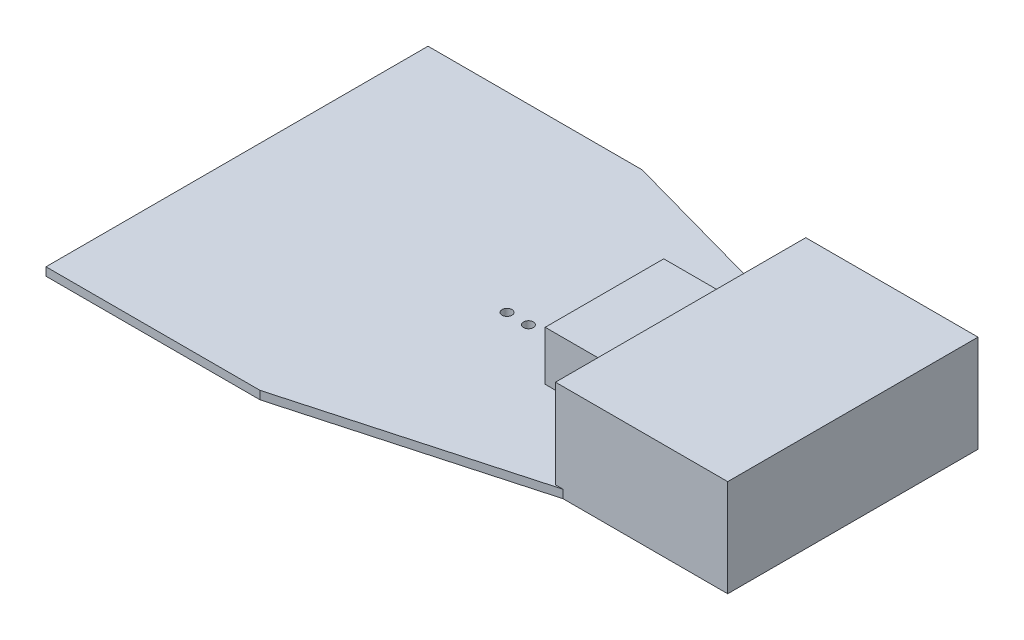
ISO-10303-21;
HEADER;
FILE_DESCRIPTION(('STEP AP214'),'2;1');
FILE_NAME('part.step','',(''),(''),'','','');
FILE_SCHEMA(('AUTOMOTIVE_DESIGN { 1 0 10303 214 1 1 1 1 }'));
ENDSEC;
DATA;
#1=APPLICATION_CONTEXT('core data for automotive mechanical design processes');
#2=APPLICATION_PROTOCOL_DEFINITION('international standard','automotive_design',2000,#1);
#3=PRODUCT_CONTEXT('',#1,'mechanical');
#4=PRODUCT('Part','Part','',(#3));
#5=PRODUCT_RELATED_PRODUCT_CATEGORY('part','',(#4));
#6=PRODUCT_DEFINITION_FORMATION('','',#4);
#7=PRODUCT_DEFINITION_CONTEXT('part definition',#1,'design');
#8=PRODUCT_DEFINITION('design','',#6,#7);
#9=PRODUCT_DEFINITION_SHAPE('','',#8);
#10=(LENGTH_UNIT() NAMED_UNIT(*) SI_UNIT(.MILLI.,.METRE.));
#11=(NAMED_UNIT(*) PLANE_ANGLE_UNIT() SI_UNIT($,.RADIAN.));
#12=(NAMED_UNIT(*) SI_UNIT($,.STERADIAN.) SOLID_ANGLE_UNIT());
#13=UNCERTAINTY_MEASURE_WITH_UNIT(LENGTH_MEASURE(1.E-05),#10,'distance_accuracy_value','');
#14=(GEOMETRIC_REPRESENTATION_CONTEXT(3) GLOBAL_UNCERTAINTY_ASSIGNED_CONTEXT((#13)) GLOBAL_UNIT_ASSIGNED_CONTEXT((#10,
#11,#12)) REPRESENTATION_CONTEXT('',''));
#15=CARTESIAN_POINT('',(0.,0.,0.));
#16=DIRECTION('',(0.,0.,1.));
#17=DIRECTION('',(1.,0.,0.));
#18=AXIS2_PLACEMENT_3D('',#15,#16,#17);
#19=CARTESIAN_POINT('',(0.,2.5,0.));
#20=DIRECTION('',(0.,1.,0.));
#21=DIRECTION('',(0.,0.,1.));
#22=AXIS2_PLACEMENT_3D('',#19,#20,#21);
#23=PLANE('',#22);
#24=CARTESIAN_POINT('',(-39.6368268534392,2.5,14.1756485798957));
#25=DIRECTION('',(0.,1.,0.));
#26=DIRECTION('',(0.,0.,1.));
#27=AXIS2_PLACEMENT_3D('',#24,#25,#26);
#28=CIRCLE('',#27,1.5);
#29=CARTESIAN_POINT('',(-39.6368268534392,2.5,15.6756485798957));
#30=VERTEX_POINT('',#29);
#31=EDGE_CURVE('E217',#30,#30,#28,.T.);
#32=ORIENTED_EDGE('',*,*,#31,.F.);
#33=EDGE_LOOP('',(#32));
#34=FACE_BOUND('',#33,.T.);
#35=CARTESIAN_POINT('',(-33.1368268534392,2.5,14.1756485798957));
#36=DIRECTION('',(0.,1.,0.));
#37=DIRECTION('',(0.,0.,1.));
#38=AXIS2_PLACEMENT_3D('',#35,#36,#37);
#39=CIRCLE('',#38,1.5);
#40=CARTESIAN_POINT('',(-33.1368268534392,2.5,15.6756485798957));
#41=VERTEX_POINT('',#40);
#42=EDGE_CURVE('E214',#41,#41,#39,.T.);
#43=ORIENTED_EDGE('',*,*,#42,.F.);
#44=EDGE_LOOP('',(#43));
#45=FACE_BOUND('',#44,.T.);
#46=CARTESIAN_POINT('',(-0.936826853439245,2.5,-11.3521291978821));
#47=DIRECTION('',(0.,1.,0.));
#48=DIRECTION('',(0.,0.,1.));
#49=AXIS2_PLACEMENT_3D('',#46,#47,#48);
#50=CIRCLE('',#49,1.5);
#51=CARTESIAN_POINT('',(-0.936826853439245,2.5,-9.85212919788209));
#52=VERTEX_POINT('',#51);
#53=EDGE_CURVE('E205',#52,#52,#50,.T.);
#54=ORIENTED_EDGE('',*,*,#53,.F.);
#55=EDGE_LOOP('',(#54));
#56=FACE_BOUND('',#55,.T.);
#57=CARTESIAN_POINT('',(-0.93682685343924,2.5,29.9478708021179));
#58=DIRECTION('',(0.,1.,0.));
#59=DIRECTION('',(0.,0.,1.));
#60=AXIS2_PLACEMENT_3D('',#57,#58,#59);
#61=CIRCLE('',#60,1.5);
#62=CARTESIAN_POINT('',(-0.93682685343924,2.5,31.4478708021179));
#63=VERTEX_POINT('',#62);
#64=EDGE_CURVE('E202',#63,#63,#61,.T.);
#65=ORIENTED_EDGE('',*,*,#64,.F.);
#66=EDGE_LOOP('',(#65));
#67=FACE_BOUND('',#66,.T.);
#68=DIRECTION('',(0.,0.,1.));
#69=VECTOR('',#68,1.);
#70=CARTESIAN_POINT('',(13.0631731465608,2.5,-23.8243514201043));
#71=LINE('',#70,#69);
#72=CARTESIAN_POINT('',(13.0631731465608,2.5,-23.8243514201043));
#73=VERTEX_POINT('',#72);
#74=CARTESIAN_POINT('',(13.0631731465608,2.5,-8.7021291978821));
#75=VERTEX_POINT('',#74);
#76=EDGE_CURVE('E50',#73,#75,#71,.T.);
#77=ORIENTED_EDGE('',*,*,#76,.F.);
#78=DIRECTION('',(-1.,0.,0.));
#79=VECTOR('',#78,1.);
#80=CARTESIAN_POINT('',(65.3631731465608,2.5,-23.8243514201043));
#81=LINE('',#80,#79);
#82=CARTESIAN_POINT('',(15.3631731465607,2.5,-23.8243514201043));
#83=VERTEX_POINT('',#82);
#84=EDGE_CURVE('E166',#83,#73,#81,.T.);
#85=ORIENTED_EDGE('',*,*,#84,.F.);
#86=DIRECTION('',(-0.963517909629941,0.,-0.267643863786095));
#87=VECTOR('',#86,1.);
#88=CARTESIAN_POINT('',(7.24432938817596,2.5,-26.0795857974334));
#89=LINE('',#88,#87);
#90=CARTESIAN_POINT('',(-56.6368268534393,2.5,-43.8243514201043));
#91=VERTEX_POINT('',#90);
#92=EDGE_CURVE('E228',#83,#91,#89,.T.);
#93=ORIENTED_EDGE('',*,*,#92,.T.);
#94=DIRECTION('',(-1.,0.,0.));
#95=VECTOR('',#94,1.);
#96=CARTESIAN_POINT('',(0.,2.5,-43.8243514201043));
#97=LINE('',#96,#95);
#98=CARTESIAN_POINT('',(-121.636826853439,2.5,-43.8243514201043));
#99=VERTEX_POINT('',#98);
#100=EDGE_CURVE('E231',#91,#99,#97,.T.);
#101=ORIENTED_EDGE('',*,*,#100,.T.);
#102=DIRECTION('',(0.,0.,1.));
#103=VECTOR('',#102,1.);
#104=CARTESIAN_POINT('',(-121.636826853439,2.5,0.));
#105=LINE('',#104,#103);
#106=CARTESIAN_POINT('',(-121.636826853439,2.5,72.1756485798957));
#107=VERTEX_POINT('',#106);
#108=EDGE_CURVE('E233',#99,#107,#105,.T.);
#109=ORIENTED_EDGE('',*,*,#108,.T.);
#110=DIRECTION('',(1.,0.,0.));
#111=VECTOR('',#110,1.);
#112=CARTESIAN_POINT('',(0.,2.5,72.1756485798957));
#113=LINE('',#112,#111);
#114=CARTESIAN_POINT('',(-56.6368268534393,2.5,72.1756485798957));
#115=VERTEX_POINT('',#114);
#116=EDGE_CURVE('E235',#107,#115,#113,.T.);
#117=ORIENTED_EDGE('',*,*,#116,.T.);
#118=DIRECTION('',(0.963517909629941,0.,-0.267643863786095));
#119=VECTOR('',#118,1.);
#120=CARTESIAN_POINT('',(14.5555521514459,2.5,52.3999877452054));
#121=LINE('',#120,#119);
#122=CARTESIAN_POINT('',(15.3631731465607,2.5,52.1756485798957));
#123=VERTEX_POINT('',#122);
#124=EDGE_CURVE('E226',#115,#123,#121,.T.);
#125=ORIENTED_EDGE('',*,*,#124,.T.);
#126=DIRECTION('',(1.,0.,0.));
#127=VECTOR('',#126,1.);
#128=CARTESIAN_POINT('',(65.3631731465608,2.5,52.1756485798957));
#129=LINE('',#128,#127);
#130=CARTESIAN_POINT('',(13.0631731465608,2.5,52.1756485798957));
#131=VERTEX_POINT('',#130);
#132=EDGE_CURVE('E57',#131,#123,#129,.T.);
#133=ORIENTED_EDGE('',*,*,#132,.F.);
#134=CARTESIAN_POINT('',(13.0631731465608,2.5,27.2978708021179));
#135=VERTEX_POINT('',#134);
#136=EDGE_CURVE('E168',#135,#131,#71,.T.);
#137=ORIENTED_EDGE('',*,*,#136,.F.);
#138=DIRECTION('',(1.,0.,0.));
#139=VECTOR('',#138,1.);
#140=CARTESIAN_POINT('',(0.,2.5,27.2978708021179));
#141=LINE('',#140,#139);
#142=CARTESIAN_POINT('',(-14.9368268534392,2.5,27.2978708021179));
#143=VERTEX_POINT('',#142);
#144=EDGE_CURVE('E178',#143,#135,#141,.T.);
#145=ORIENTED_EDGE('',*,*,#144,.F.);
#146=DIRECTION('',(0.,0.,1.));
#147=VECTOR('',#146,1.);
#148=CARTESIAN_POINT('',(-14.9368268534392,2.5,0.));
#149=LINE('',#148,#147);
#150=CARTESIAN_POINT('',(-14.9368268534392,2.5,-8.7021291978821));
#151=VERTEX_POINT('',#150);
#152=EDGE_CURVE('E188',#151,#143,#149,.T.);
#153=ORIENTED_EDGE('',*,*,#152,.F.);
#154=DIRECTION('',(1.,0.,0.));
#155=VECTOR('',#154,1.);
#156=CARTESIAN_POINT('',(0.,2.5,-8.7021291978821));
#157=LINE('',#156,#155);
#158=EDGE_CURVE('E173',#151,#75,#157,.T.);
#159=ORIENTED_EDGE('',*,*,#158,.T.);
#160=EDGE_LOOP('',(#77,#85,#93,#101,#109,#117,#125,#133,#137,#145,#153,#159));
#161=FACE_BOUND('',#160,.T.);
#162=ADVANCED_FACE('F35',(#34,#45,#56,#67,#161),#23,.T.);
#163=CARTESIAN_POINT('',(14.5555521514459,2.5,52.3999877452054));
#164=DIRECTION('',(-0.267643863786095,0.,-0.963517909629941));
#165=DIRECTION('',(-0.963517909629941,0.,0.267643863786095));
#166=AXIS2_PLACEMENT_3D('',#163,#164,#165);
#167=PLANE('',#166);
#168=DIRECTION('',(0.963517909629941,0.,-0.267643863786095));
#169=VECTOR('',#168,1.);
#170=CARTESIAN_POINT('',(14.5555521514459,0.,52.3999877452054));
#171=LINE('',#170,#169);
#172=CARTESIAN_POINT('',(-56.6368268534393,0.,72.1756485798957));
#173=VERTEX_POINT('',#172);
#174=CARTESIAN_POINT('',(15.3631731465607,0.,52.1756485798957));
#175=VERTEX_POINT('',#174);
#176=EDGE_CURVE('E223',#173,#175,#171,.T.);
#177=ORIENTED_EDGE('',*,*,#176,.T.);
#178=DIRECTION('',(0.,-1.,0.));
#179=VECTOR('',#178,1.);
#180=CARTESIAN_POINT('',(15.3631731465607,2.5,52.1756485798957));
#181=LINE('',#180,#179);
#182=EDGE_CURVE('E11',#123,#175,#181,.T.);
#183=ORIENTED_EDGE('',*,*,#182,.F.);
#184=ORIENTED_EDGE('',*,*,#124,.F.);
#185=DIRECTION('',(0.,-1.,0.));
#186=VECTOR('',#185,1.);
#187=CARTESIAN_POINT('',(-56.6368268534393,2.5,72.1756485798957));
#188=LINE('',#187,#186);
#189=EDGE_CURVE('E237',#115,#173,#188,.T.);
#190=ORIENTED_EDGE('',*,*,#189,.T.);
#191=EDGE_LOOP('',(#177,#183,#184,#190));
#192=FACE_BOUND('',#191,.T.);
#193=ADVANCED_FACE('F37',(#192),#167,.F.);
#194=CARTESIAN_POINT('',(0.,2.5,52.1756485798957));
#195=DIRECTION('',(0.,0.,1.));
#196=DIRECTION('',(1.,0.,0.));
#197=AXIS2_PLACEMENT_3D('',#194,#195,#196);
#198=PLANE('',#197);
#199=DIRECTION('',(-1.,0.,0.));
#200=VECTOR('',#199,1.);
#201=CARTESIAN_POINT('',(0.,0.,52.1756485798957));
#202=LINE('',#201,#200);
#203=CARTESIAN_POINT('',(65.3631731465608,0.,52.1756485798957));
#204=VERTEX_POINT('',#203);
#205=EDGE_CURVE('E240',#204,#175,#202,.T.);
#206=ORIENTED_EDGE('',*,*,#205,.F.);
#207=DIRECTION('',(0.,-1.,0.));
#208=VECTOR('',#207,1.);
#209=CARTESIAN_POINT('',(65.3631731465608,2.5,52.1756485798957));
#210=LINE('',#209,#208);
#211=CARTESIAN_POINT('',(65.3631731465608,29.5,52.1756485798957));
#212=VERTEX_POINT('',#211);
#213=EDGE_CURVE('E43',#212,#204,#210,.T.);
#214=ORIENTED_EDGE('',*,*,#213,.F.);
#215=DIRECTION('',(1.,0.,0.));
#216=VECTOR('',#215,1.);
#217=CARTESIAN_POINT('',(65.3631731465608,29.5,52.1756485798957));
#218=LINE('',#217,#216);
#219=CARTESIAN_POINT('',(13.0631731465608,29.5,52.1756485798957));
#220=VERTEX_POINT('',#219);
#221=EDGE_CURVE('E159',#220,#212,#218,.T.);
#222=ORIENTED_EDGE('',*,*,#221,.F.);
#223=DIRECTION('',(0.,-1.,0.));
#224=VECTOR('',#223,1.);
#225=CARTESIAN_POINT('',(13.0631731465608,29.5,52.1756485798957));
#226=LINE('',#225,#224);
#227=EDGE_CURVE('E165',#220,#131,#226,.T.);
#228=ORIENTED_EDGE('',*,*,#227,.T.);
#229=ORIENTED_EDGE('',*,*,#132,.T.);
#230=ORIENTED_EDGE('',*,*,#182,.T.);
#231=EDGE_LOOP('',(#206,#214,#222,#228,#229,#230));
#232=FACE_BOUND('',#231,.T.);
#233=ADVANCED_FACE('F266',(#232),#198,.T.);
#234=CARTESIAN_POINT('',(65.3631731465608,2.5,0.));
#235=DIRECTION('',(1.,0.,0.));
#236=DIRECTION('',(0.,0.,-1.));
#237=AXIS2_PLACEMENT_3D('',#234,#235,#236);
#238=PLANE('',#237);
#239=DIRECTION('',(0.,0.,1.));
#240=VECTOR('',#239,1.);
#241=CARTESIAN_POINT('',(65.3631731465608,0.,0.));
#242=LINE('',#241,#240);
#243=CARTESIAN_POINT('',(65.3631731465608,0.,-23.8243514201043));
#244=VERTEX_POINT('',#243);
#245=EDGE_CURVE('E141',#244,#204,#242,.T.);
#246=ORIENTED_EDGE('',*,*,#245,.F.);
#247=DIRECTION('',(0.,-1.,0.));
#248=VECTOR('',#247,1.);
#249=CARTESIAN_POINT('',(65.3631731465608,2.5,-23.8243514201043));
#250=LINE('',#249,#248);
#251=CARTESIAN_POINT('',(65.3631731465608,29.5,-23.8243514201043));
#252=VERTEX_POINT('',#251);
#253=EDGE_CURVE('E135',#252,#244,#250,.T.);
#254=ORIENTED_EDGE('',*,*,#253,.F.);
#255=DIRECTION('',(0.,0.,-1.));
#256=VECTOR('',#255,1.);
#257=CARTESIAN_POINT('',(65.3631731465608,29.5,-23.8243514201043));
#258=LINE('',#257,#256);
#259=EDGE_CURVE('E139',#212,#252,#258,.T.);
#260=ORIENTED_EDGE('',*,*,#259,.F.);
#261=ORIENTED_EDGE('',*,*,#213,.T.);
#262=EDGE_LOOP('',(#246,#254,#260,#261));
#263=FACE_BOUND('',#262,.T.);
#264=ADVANCED_FACE('F137',(#263),#238,.T.);
#265=CARTESIAN_POINT('',(0.,2.5,-23.8243514201043));
#266=DIRECTION('',(0.,0.,-1.));
#267=DIRECTION('',(-1.,0.,0.));
#268=AXIS2_PLACEMENT_3D('',#265,#266,#267);
#269=PLANE('',#268);
#270=DIRECTION('',(1.,0.,0.));
#271=VECTOR('',#270,1.);
#272=CARTESIAN_POINT('',(0.,0.,-23.8243514201043));
#273=LINE('',#272,#271);
#274=CARTESIAN_POINT('',(15.3631731465607,0.,-23.8243514201043));
#275=VERTEX_POINT('',#274);
#276=EDGE_CURVE('E244',#275,#244,#273,.T.);
#277=ORIENTED_EDGE('',*,*,#276,.F.);
#278=DIRECTION('',(0.,-1.,0.));
#279=VECTOR('',#278,1.);
#280=CARTESIAN_POINT('',(15.3631731465607,2.5,-23.8243514201043));
#281=LINE('',#280,#279);
#282=EDGE_CURVE('E145',#83,#275,#281,.T.);
#283=ORIENTED_EDGE('',*,*,#282,.F.);
#284=ORIENTED_EDGE('',*,*,#84,.T.);
#285=DIRECTION('',(0.,-1.,0.));
#286=VECTOR('',#285,1.);
#287=CARTESIAN_POINT('',(13.0631731465608,29.5,-23.8243514201043));
#288=LINE('',#287,#286);
#289=CARTESIAN_POINT('',(13.0631731465608,29.5,-23.8243514201043));
#290=VERTEX_POINT('',#289);
#291=EDGE_CURVE('E151',#290,#73,#288,.T.);
#292=ORIENTED_EDGE('',*,*,#291,.F.);
#293=DIRECTION('',(-1.,0.,0.));
#294=VECTOR('',#293,1.);
#295=CARTESIAN_POINT('',(65.3631731465608,29.5,-23.8243514201043));
#296=LINE('',#295,#294);
#297=EDGE_CURVE('E148',#252,#290,#296,.T.);
#298=ORIENTED_EDGE('',*,*,#297,.F.);
#299=ORIENTED_EDGE('',*,*,#253,.T.);
#300=EDGE_LOOP('',(#277,#283,#284,#292,#298,#299));
#301=FACE_BOUND('',#300,.T.);
#302=ADVANCED_FACE('F149',(#301),#269,.T.);
#303=CARTESIAN_POINT('',(7.24432938817596,2.5,-26.0795857974334));
#304=DIRECTION('',(-0.267643863786095,0.,0.963517909629941));
#305=DIRECTION('',(0.963517909629941,0.,0.267643863786095));
#306=AXIS2_PLACEMENT_3D('',#303,#304,#305);
#307=PLANE('',#306);
#308=DIRECTION('',(-0.963517909629941,0.,-0.267643863786095));
#309=VECTOR('',#308,1.);
#310=CARTESIAN_POINT('',(7.24432938817596,0.,-26.0795857974334));
#311=LINE('',#310,#309);
#312=CARTESIAN_POINT('',(-56.6368268534393,0.,-43.8243514201043));
#313=VERTEX_POINT('',#312);
#314=EDGE_CURVE('E246',#275,#313,#311,.T.);
#315=ORIENTED_EDGE('',*,*,#314,.T.);
#316=DIRECTION('',(0.,-1.,0.));
#317=VECTOR('',#316,1.);
#318=CARTESIAN_POINT('',(-56.6368268534393,2.5,-43.8243514201043));
#319=LINE('',#318,#317);
#320=EDGE_CURVE('E261',#91,#313,#319,.T.);
#321=ORIENTED_EDGE('',*,*,#320,.F.);
#322=ORIENTED_EDGE('',*,*,#92,.F.);
#323=ORIENTED_EDGE('',*,*,#282,.T.);
#324=EDGE_LOOP('',(#315,#321,#322,#323));
#325=FACE_BOUND('',#324,.T.);
#326=ADVANCED_FACE('F277',(#325),#307,.F.);
#327=CARTESIAN_POINT('',(0.,2.5,-43.8243514201043));
#328=DIRECTION('',(0.,0.,1.));
#329=DIRECTION('',(1.,0.,0.));
#330=AXIS2_PLACEMENT_3D('',#327,#328,#329);
#331=PLANE('',#330);
#332=DIRECTION('',(-1.,0.,0.));
#333=VECTOR('',#332,1.);
#334=CARTESIAN_POINT('',(0.,0.,-43.8243514201043));
#335=LINE('',#334,#333);
#336=CARTESIAN_POINT('',(-121.636826853439,0.,-43.8243514201043));
#337=VERTEX_POINT('',#336);
#338=EDGE_CURVE('E248',#313,#337,#335,.T.);
#339=ORIENTED_EDGE('',*,*,#338,.T.);
#340=DIRECTION('',(0.,-1.,0.));
#341=VECTOR('',#340,1.);
#342=CARTESIAN_POINT('',(-121.636826853439,2.5,-43.8243514201043));
#343=LINE('',#342,#341);
#344=EDGE_CURVE('E258',#99,#337,#343,.T.);
#345=ORIENTED_EDGE('',*,*,#344,.F.);
#346=ORIENTED_EDGE('',*,*,#100,.F.);
#347=ORIENTED_EDGE('',*,*,#320,.T.);
#348=EDGE_LOOP('',(#339,#345,#346,#347));
#349=FACE_BOUND('',#348,.T.);
#350=ADVANCED_FACE('F283',(#349),#331,.F.);
#351=CARTESIAN_POINT('',(-121.636826853439,2.5,0.));
#352=DIRECTION('',(1.,0.,0.));
#353=DIRECTION('',(0.,0.,-1.));
#354=AXIS2_PLACEMENT_3D('',#351,#352,#353);
#355=PLANE('',#354);
#356=DIRECTION('',(0.,0.,1.));
#357=VECTOR('',#356,1.);
#358=CARTESIAN_POINT('',(-121.636826853439,0.,0.));
#359=LINE('',#358,#357);
#360=CARTESIAN_POINT('',(-121.636826853439,0.,72.1756485798957));
#361=VERTEX_POINT('',#360);
#362=EDGE_CURVE('E250',#337,#361,#359,.T.);
#363=ORIENTED_EDGE('',*,*,#362,.T.);
#364=DIRECTION('',(0.,-1.,0.));
#365=VECTOR('',#364,1.);
#366=CARTESIAN_POINT('',(-121.636826853439,2.5,72.1756485798957));
#367=LINE('',#366,#365);
#368=EDGE_CURVE('E255',#107,#361,#367,.T.);
#369=ORIENTED_EDGE('',*,*,#368,.F.);
#370=ORIENTED_EDGE('',*,*,#108,.F.);
#371=ORIENTED_EDGE('',*,*,#344,.T.);
#372=EDGE_LOOP('',(#363,#369,#370,#371));
#373=FACE_BOUND('',#372,.T.);
#374=ADVANCED_FACE('F286',(#373),#355,.F.);
#375=CARTESIAN_POINT('',(0.,2.5,72.1756485798957));
#376=DIRECTION('',(0.,0.,-1.));
#377=DIRECTION('',(-1.,0.,0.));
#378=AXIS2_PLACEMENT_3D('',#375,#376,#377);
#379=PLANE('',#378);
#380=DIRECTION('',(1.,0.,0.));
#381=VECTOR('',#380,1.);
#382=CARTESIAN_POINT('',(0.,0.,72.1756485798957));
#383=LINE('',#382,#381);
#384=EDGE_CURVE('E229',#361,#173,#383,.T.);
#385=ORIENTED_EDGE('',*,*,#384,.T.);
#386=ORIENTED_EDGE('',*,*,#189,.F.);
#387=ORIENTED_EDGE('',*,*,#116,.F.);
#388=ORIENTED_EDGE('',*,*,#368,.T.);
#389=EDGE_LOOP('',(#385,#386,#387,#388));
#390=FACE_BOUND('',#389,.T.);
#391=ADVANCED_FACE('F291',(#390),#379,.F.);
#392=CARTESIAN_POINT('',(0.,0.,0.));
#393=DIRECTION('',(0.,1.,0.));
#394=DIRECTION('',(0.,0.,1.));
#395=AXIS2_PLACEMENT_3D('',#392,#393,#394);
#396=PLANE('',#395);
#397=CARTESIAN_POINT('',(-0.93682685343924,0.,29.9478708021179));
#398=DIRECTION('',(0.,1.,0.));
#399=DIRECTION('',(0.,0.,1.));
#400=AXIS2_PLACEMENT_3D('',#397,#398,#399);
#401=CIRCLE('',#400,1.5);
#402=CARTESIAN_POINT('',(-0.93682685343924,0.,31.4478708021179));
#403=VERTEX_POINT('',#402);
#404=EDGE_CURVE('E201',#403,#403,#401,.T.);
#405=ORIENTED_EDGE('',*,*,#404,.T.);
#406=EDGE_LOOP('',(#405));
#407=FACE_BOUND('',#406,.T.);
#408=CARTESIAN_POINT('',(-0.936826853439245,0.,-11.3521291978821));
#409=DIRECTION('',(0.,1.,0.));
#410=DIRECTION('',(0.,0.,1.));
#411=AXIS2_PLACEMENT_3D('',#408,#409,#410);
#412=CIRCLE('',#411,1.5);
#413=CARTESIAN_POINT('',(-0.936826853439245,0.,-9.85212919788209));
#414=VERTEX_POINT('',#413);
#415=EDGE_CURVE('E208',#414,#414,#412,.T.);
#416=ORIENTED_EDGE('',*,*,#415,.T.);
#417=EDGE_LOOP('',(#416));
#418=FACE_BOUND('',#417,.T.);
#419=CARTESIAN_POINT('',(-33.1368268534392,0.,14.1756485798957));
#420=DIRECTION('',(0.,1.,0.));
#421=DIRECTION('',(0.,0.,1.));
#422=AXIS2_PLACEMENT_3D('',#419,#420,#421);
#423=CIRCLE('',#422,1.5);
#424=CARTESIAN_POINT('',(-33.1368268534392,0.,15.6756485798957));
#425=VERTEX_POINT('',#424);
#426=EDGE_CURVE('E211',#425,#425,#423,.T.);
#427=ORIENTED_EDGE('',*,*,#426,.T.);
#428=EDGE_LOOP('',(#427));
#429=FACE_BOUND('',#428,.T.);
#430=CARTESIAN_POINT('',(-39.6368268534392,0.,14.1756485798957));
#431=DIRECTION('',(0.,1.,0.));
#432=DIRECTION('',(0.,0.,1.));
#433=AXIS2_PLACEMENT_3D('',#430,#431,#432);
#434=CIRCLE('',#433,1.5);
#435=CARTESIAN_POINT('',(-39.6368268534392,0.,15.6756485798957));
#436=VERTEX_POINT('',#435);
#437=EDGE_CURVE('E220',#436,#436,#434,.T.);
#438=ORIENTED_EDGE('',*,*,#437,.T.);
#439=EDGE_LOOP('',(#438));
#440=FACE_BOUND('',#439,.T.);
#441=ORIENTED_EDGE('',*,*,#176,.F.);
#442=ORIENTED_EDGE('',*,*,#384,.F.);
#443=ORIENTED_EDGE('',*,*,#362,.F.);
#444=ORIENTED_EDGE('',*,*,#338,.F.);
#445=ORIENTED_EDGE('',*,*,#314,.F.);
#446=ORIENTED_EDGE('',*,*,#276,.T.);
#447=ORIENTED_EDGE('',*,*,#245,.T.);
#448=ORIENTED_EDGE('',*,*,#205,.T.);
#449=EDGE_LOOP('',(#441,#442,#443,#444,#445,#446,#447,#448));
#450=FACE_BOUND('',#449,.T.);
#451=ADVANCED_FACE('F270',(#407,#418,#429,#440,#450),#396,.F.);
#452=CARTESIAN_POINT('',(-39.6368268534392,0.,14.1756485798957));
#453=DIRECTION('',(0.,1.,0.));
#454=DIRECTION('',(0.,0.,1.));
#455=AXIS2_PLACEMENT_3D('',#452,#453,#454);
#456=CYLINDRICAL_SURFACE('',#455,1.5);
#457=ORIENTED_EDGE('',*,*,#437,.F.);
#458=EDGE_LOOP('',(#457));
#459=FACE_BOUND('',#458,.T.);
#460=ORIENTED_EDGE('',*,*,#31,.T.);
#461=EDGE_LOOP('',(#460));
#462=FACE_BOUND('',#461,.T.);
#463=ADVANCED_FACE('F331',(#459,#462),#456,.F.);
#464=CARTESIAN_POINT('',(-33.1368268534392,0.,14.1756485798957));
#465=DIRECTION('',(0.,1.,0.));
#466=DIRECTION('',(0.,0.,1.));
#467=AXIS2_PLACEMENT_3D('',#464,#465,#466);
#468=CYLINDRICAL_SURFACE('',#467,1.5);
#469=ORIENTED_EDGE('',*,*,#426,.F.);
#470=EDGE_LOOP('',(#469));
#471=FACE_BOUND('',#470,.T.);
#472=ORIENTED_EDGE('',*,*,#42,.T.);
#473=EDGE_LOOP('',(#472));
#474=FACE_BOUND('',#473,.T.);
#475=ADVANCED_FACE('F389',(#471,#474),#468,.F.);
#476=CARTESIAN_POINT('',(-0.936826853439245,0.,-11.3521291978821));
#477=DIRECTION('',(0.,1.,0.));
#478=DIRECTION('',(0.,0.,1.));
#479=AXIS2_PLACEMENT_3D('',#476,#477,#478);
#480=CYLINDRICAL_SURFACE('',#479,1.5);
#481=ORIENTED_EDGE('',*,*,#415,.F.);
#482=EDGE_LOOP('',(#481));
#483=FACE_BOUND('',#482,.T.);
#484=ORIENTED_EDGE('',*,*,#53,.T.);
#485=EDGE_LOOP('',(#484));
#486=FACE_BOUND('',#485,.T.);
#487=ADVANCED_FACE('F395',(#483,#486),#480,.F.);
#488=CARTESIAN_POINT('',(-0.93682685343924,0.,29.9478708021179));
#489=DIRECTION('',(0.,1.,0.));
#490=DIRECTION('',(0.,0.,1.));
#491=AXIS2_PLACEMENT_3D('',#488,#489,#490);
#492=CYLINDRICAL_SURFACE('',#491,1.5);
#493=ORIENTED_EDGE('',*,*,#404,.F.);
#494=EDGE_LOOP('',(#493));
#495=FACE_BOUND('',#494,.T.);
#496=ORIENTED_EDGE('',*,*,#64,.T.);
#497=EDGE_LOOP('',(#496));
#498=FACE_BOUND('',#497,.T.);
#499=ADVANCED_FACE('F401',(#495,#498),#492,.F.);
#500=CARTESIAN_POINT('',(0.,17.5,-8.7021291978821));
#501=DIRECTION('',(0.,0.,-1.));
#502=DIRECTION('',(-1.,0.,0.));
#503=AXIS2_PLACEMENT_3D('',#500,#501,#502);
#504=PLANE('',#503);
#505=ORIENTED_EDGE('',*,*,#158,.F.);
#506=DIRECTION('',(0.,-1.,0.));
#507=VECTOR('',#506,1.);
#508=CARTESIAN_POINT('',(-14.9368268534392,17.5,-8.7021291978821));
#509=LINE('',#508,#507);
#510=CARTESIAN_POINT('',(-14.9368268534392,17.5,-8.7021291978821));
#511=VERTEX_POINT('',#510);
#512=EDGE_CURVE('E197',#511,#151,#509,.T.);
#513=ORIENTED_EDGE('',*,*,#512,.F.);
#514=DIRECTION('',(1.,0.,0.));
#515=VECTOR('',#514,1.);
#516=CARTESIAN_POINT('',(0.,17.5,-8.7021291978821));
#517=LINE('',#516,#515);
#518=CARTESIAN_POINT('',(13.0631731465608,17.5,-8.7021291978821));
#519=VERTEX_POINT('',#518);
#520=EDGE_CURVE('E177',#511,#519,#517,.T.);
#521=ORIENTED_EDGE('',*,*,#520,.T.);
#522=DIRECTION('',(0.,-1.,0.));
#523=VECTOR('',#522,1.);
#524=CARTESIAN_POINT('',(13.0631731465608,17.5,-8.7021291978821));
#525=LINE('',#524,#523);
#526=EDGE_CURVE('E199',#519,#75,#525,.T.);
#527=ORIENTED_EDGE('',*,*,#526,.T.);
#528=EDGE_LOOP('',(#505,#513,#521,#527));
#529=FACE_BOUND('',#528,.T.);
#530=ADVANCED_FACE('F309',(#529),#504,.T.);
#531=CARTESIAN_POINT('',(-14.9368268534392,17.5,0.));
#532=DIRECTION('',(1.,0.,0.));
#533=DIRECTION('',(0.,0.,-1.));
#534=AXIS2_PLACEMENT_3D('',#531,#532,#533);
#535=PLANE('',#534);
#536=ORIENTED_EDGE('',*,*,#152,.T.);
#537=DIRECTION('',(0.,-1.,0.));
#538=VECTOR('',#537,1.);
#539=CARTESIAN_POINT('',(-14.9368268534392,17.5,27.2978708021179));
#540=LINE('',#539,#538);
#541=CARTESIAN_POINT('',(-14.9368268534392,17.5,27.2978708021179));
#542=VERTEX_POINT('',#541);
#543=EDGE_CURVE('E195',#542,#143,#540,.T.);
#544=ORIENTED_EDGE('',*,*,#543,.F.);
#545=DIRECTION('',(0.,0.,1.));
#546=VECTOR('',#545,1.);
#547=CARTESIAN_POINT('',(-14.9368268534392,17.5,0.));
#548=LINE('',#547,#546);
#549=EDGE_CURVE('E181',#511,#542,#548,.T.);
#550=ORIENTED_EDGE('',*,*,#549,.F.);
#551=ORIENTED_EDGE('',*,*,#512,.T.);
#552=EDGE_LOOP('',(#536,#544,#550,#551));
#553=FACE_BOUND('',#552,.T.);
#554=ADVANCED_FACE('F306',(#553),#535,.F.);
#555=CARTESIAN_POINT('',(0.,17.5,27.2978708021179));
#556=DIRECTION('',(0.,0.,-1.));
#557=DIRECTION('',(-1.,0.,0.));
#558=AXIS2_PLACEMENT_3D('',#555,#556,#557);
#559=PLANE('',#558);
#560=ORIENTED_EDGE('',*,*,#144,.T.);
#561=DIRECTION('',(0.,-1.,0.));
#562=VECTOR('',#561,1.);
#563=CARTESIAN_POINT('',(13.0631731465608,17.5,27.2978708021179));
#564=LINE('',#563,#562);
#565=CARTESIAN_POINT('',(13.0631731465608,17.5,27.2978708021179));
#566=VERTEX_POINT('',#565);
#567=EDGE_CURVE('E186',#566,#135,#564,.T.);
#568=ORIENTED_EDGE('',*,*,#567,.F.);
#569=DIRECTION('',(1.,0.,0.));
#570=VECTOR('',#569,1.);
#571=CARTESIAN_POINT('',(0.,17.5,27.2978708021179));
#572=LINE('',#571,#570);
#573=EDGE_CURVE('E183',#542,#566,#572,.T.);
#574=ORIENTED_EDGE('',*,*,#573,.F.);
#575=ORIENTED_EDGE('',*,*,#543,.T.);
#576=EDGE_LOOP('',(#560,#568,#574,#575));
#577=FACE_BOUND('',#576,.T.);
#578=ADVANCED_FACE('F301',(#577),#559,.F.);
#579=CARTESIAN_POINT('',(0.,17.5,0.));
#580=DIRECTION('',(0.,1.,0.));
#581=DIRECTION('',(0.,0.,1.));
#582=AXIS2_PLACEMENT_3D('',#579,#580,#581);
#583=PLANE('',#582);
#584=DIRECTION('',(0.,0.,1.));
#585=VECTOR('',#584,1.);
#586=CARTESIAN_POINT('',(13.0631731465608,17.5,0.));
#587=LINE('',#586,#585);
#588=EDGE_CURVE('E174',#519,#566,#587,.T.);
#589=ORIENTED_EDGE('',*,*,#588,.F.);
#590=ORIENTED_EDGE('',*,*,#520,.F.);
#591=ORIENTED_EDGE('',*,*,#549,.T.);
#592=ORIENTED_EDGE('',*,*,#573,.T.);
#593=EDGE_LOOP('',(#589,#590,#591,#592));
#594=FACE_BOUND('',#593,.T.);
#595=ADVANCED_FACE('F312',(#594),#583,.T.);
#596=CARTESIAN_POINT('',(13.0631731465608,29.5,-23.8243514201043));
#597=DIRECTION('',(1.,0.,0.));
#598=DIRECTION('',(0.,0.,-1.));
#599=AXIS2_PLACEMENT_3D('',#596,#597,#598);
#600=PLANE('',#599);
#601=ORIENTED_EDGE('',*,*,#526,.F.);
#602=ORIENTED_EDGE('',*,*,#588,.T.);
#603=ORIENTED_EDGE('',*,*,#567,.T.);
#604=ORIENTED_EDGE('',*,*,#136,.T.);
#605=ORIENTED_EDGE('',*,*,#227,.F.);
#606=DIRECTION('',(0.,0.,1.));
#607=VECTOR('',#606,1.);
#608=CARTESIAN_POINT('',(13.0631731465608,29.5,-23.8243514201043));
#609=LINE('',#608,#607);
#610=EDGE_CURVE('E154',#290,#220,#609,.T.);
#611=ORIENTED_EDGE('',*,*,#610,.F.);
#612=ORIENTED_EDGE('',*,*,#291,.T.);
#613=ORIENTED_EDGE('',*,*,#76,.T.);
#614=EDGE_LOOP('',(#601,#602,#603,#604,#605,#611,#612,#613));
#615=FACE_BOUND('',#614,.T.);
#616=ADVANCED_FACE('F297',(#615),#600,.F.);
#617=CARTESIAN_POINT('',(0.,29.5,0.));
#618=DIRECTION('',(0.,-1.,0.));
#619=DIRECTION('',(0.,0.,-1.));
#620=AXIS2_PLACEMENT_3D('',#617,#618,#619);
#621=PLANE('',#620);
#622=ORIENTED_EDGE('',*,*,#259,.T.);
#623=ORIENTED_EDGE('',*,*,#297,.T.);
#624=ORIENTED_EDGE('',*,*,#610,.T.);
#625=ORIENTED_EDGE('',*,*,#221,.T.);
#626=EDGE_LOOP('',(#622,#623,#624,#625));
#627=FACE_BOUND('',#626,.T.);
#628=ADVANCED_FACE('F157',(#627),#621,.F.);
#629=CLOSED_SHELL('',(#162,#193,#233,#264,#302,#326,#350,#374,#391,#451,#463,#475,#487,#499,
#530,#554,#578,#595,#616,#628));
#630=MANIFOLD_SOLID_BREP('B2',#629);
#631=ADVANCED_BREP_SHAPE_REPRESENTATION('',(#18,#630),#14);
#632=SHAPE_DEFINITION_REPRESENTATION(#9,#631);
ENDSEC;
END-ISO-10303-21;
